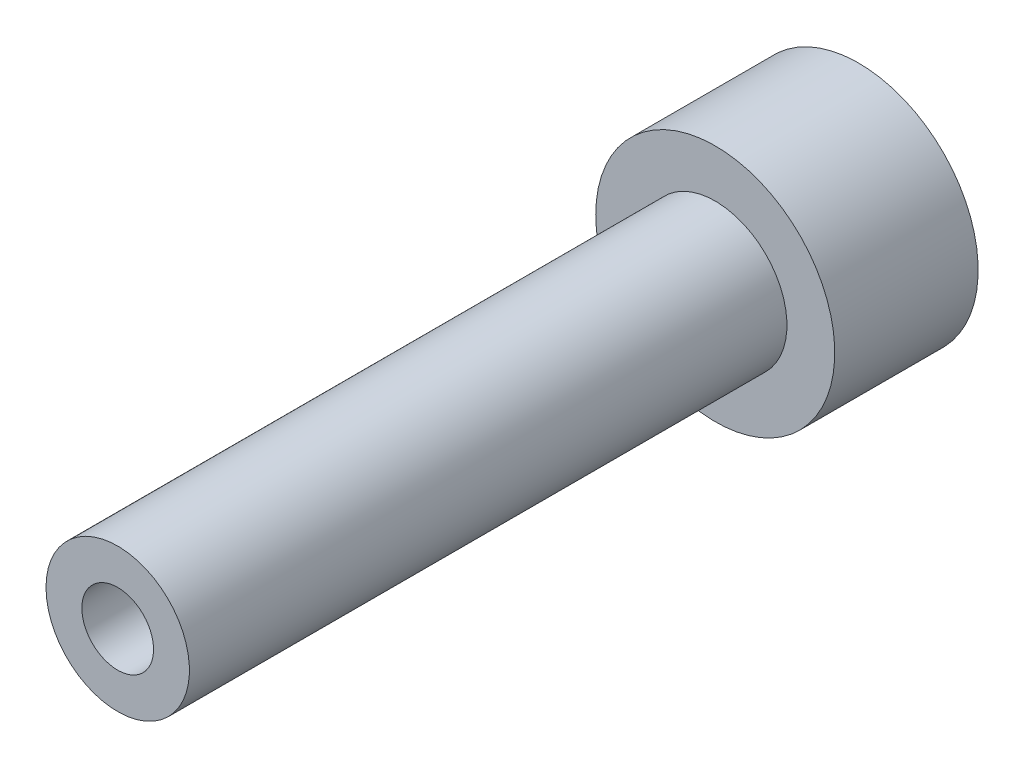
ISO-10303-21;
HEADER;
FILE_DESCRIPTION(('STEP AP214'),'2;1');
FILE_NAME('part.step','',(''),(''),'','','');
FILE_SCHEMA(('AUTOMOTIVE_DESIGN { 1 0 10303 214 1 1 1 1 }'));
ENDSEC;
DATA;
#1=APPLICATION_CONTEXT('core data for automotive mechanical design processes');
#2=APPLICATION_PROTOCOL_DEFINITION('international standard','automotive_design',2000,#1);
#3=PRODUCT_CONTEXT('',#1,'mechanical');
#4=PRODUCT('Part','Part','',(#3));
#5=PRODUCT_RELATED_PRODUCT_CATEGORY('part','',(#4));
#6=PRODUCT_DEFINITION_FORMATION('','',#4);
#7=PRODUCT_DEFINITION_CONTEXT('part definition',#1,'design');
#8=PRODUCT_DEFINITION('design','',#6,#7);
#9=PRODUCT_DEFINITION_SHAPE('','',#8);
#10=(LENGTH_UNIT() NAMED_UNIT(*) SI_UNIT(.MILLI.,.METRE.));
#11=(NAMED_UNIT(*) PLANE_ANGLE_UNIT() SI_UNIT($,.RADIAN.));
#12=(NAMED_UNIT(*) SI_UNIT($,.STERADIAN.) SOLID_ANGLE_UNIT());
#13=UNCERTAINTY_MEASURE_WITH_UNIT(LENGTH_MEASURE(1.E-05),#10,'distance_accuracy_value','');
#14=(GEOMETRIC_REPRESENTATION_CONTEXT(3) GLOBAL_UNCERTAINTY_ASSIGNED_CONTEXT((#13)) GLOBAL_UNIT_ASSIGNED_CONTEXT((#10,
#11,#12)) REPRESENTATION_CONTEXT('',''));
#15=CARTESIAN_POINT('',(0.,0.,0.));
#16=DIRECTION('',(0.,0.,1.));
#17=DIRECTION('',(1.,0.,0.));
#18=AXIS2_PLACEMENT_3D('',#15,#16,#17);
#19=CARTESIAN_POINT('',(0.,0.,0.));
#20=DIRECTION('',(0.,0.,-1.));
#21=DIRECTION('',(-1.,0.,0.));
#22=AXIS2_PLACEMENT_3D('',#19,#20,#21);
#23=CYLINDRICAL_SURFACE('',#22,0.85);
#24=CARTESIAN_POINT('',(0.,0.,0.));
#25=DIRECTION('',(0.,0.,-1.));
#26=DIRECTION('',(-1.,0.,0.));
#27=AXIS2_PLACEMENT_3D('',#24,#25,#26);
#28=CIRCLE('',#27,0.85);
#29=CARTESIAN_POINT('',(-0.85,0.,0.));
#30=VERTEX_POINT('',#29);
#31=EDGE_CURVE('E10',#30,#30,#28,.T.);
#32=ORIENTED_EDGE('',*,*,#31,.T.);
#33=EDGE_LOOP('',(#32));
#34=FACE_BOUND('',#33,.T.);
#35=CARTESIAN_POINT('',(0.,0.,2.));
#36=DIRECTION('',(0.,0.,-1.));
#37=DIRECTION('',(-1.,0.,0.));
#38=AXIS2_PLACEMENT_3D('',#35,#36,#37);
#39=CIRCLE('',#38,0.85);
#40=CARTESIAN_POINT('',(-0.85,0.,2.));
#41=VERTEX_POINT('',#40);
#42=EDGE_CURVE('E62',#41,#41,#39,.T.);
#43=ORIENTED_EDGE('',*,*,#42,.F.);
#44=EDGE_LOOP('',(#43));
#45=FACE_BOUND('',#44,.T.);
#46=ADVANCED_FACE('F34',(#34,#45),#23,.F.);
#47=CARTESIAN_POINT('',(0.,0.85,0.));
#48=DIRECTION('',(0.,0.,-1.));
#49=DIRECTION('',(-1.,0.,0.));
#50=AXIS2_PLACEMENT_3D('',#47,#48,#49);
#51=PLANE('',#50);
#52=CARTESIAN_POINT('',(0.,0.,0.));
#53=DIRECTION('',(0.,0.,-1.));
#54=DIRECTION('',(-1.,0.,0.));
#55=AXIS2_PLACEMENT_3D('',#52,#53,#54);
#56=CIRCLE('',#55,2.5);
#57=CARTESIAN_POINT('',(-2.5,0.,0.));
#58=VERTEX_POINT('',#57);
#59=EDGE_CURVE('E40',#58,#58,#56,.T.);
#60=ORIENTED_EDGE('',*,*,#59,.T.);
#61=EDGE_LOOP('',(#60));
#62=FACE_BOUND('',#61,.T.);
#63=ORIENTED_EDGE('',*,*,#31,.F.);
#64=EDGE_LOOP('',(#63));
#65=FACE_BOUND('',#64,.T.);
#66=ADVANCED_FACE('F70',(#62,#65),#51,.T.);
#67=CARTESIAN_POINT('',(0.,0.,0.));
#68=DIRECTION('',(0.,0.,-1.));
#69=DIRECTION('',(-1.,0.,0.));
#70=AXIS2_PLACEMENT_3D('',#67,#68,#69);
#71=CYLINDRICAL_SURFACE('',#70,2.5);
#72=CARTESIAN_POINT('',(0.,0.,3.));
#73=DIRECTION('',(0.,0.,-1.));
#74=DIRECTION('',(-1.,0.,0.));
#75=AXIS2_PLACEMENT_3D('',#72,#73,#74);
#76=CIRCLE('',#75,2.5);
#77=CARTESIAN_POINT('',(-2.5,0.,3.));
#78=VERTEX_POINT('',#77);
#79=EDGE_CURVE('E44',#78,#78,#76,.T.);
#80=ORIENTED_EDGE('',*,*,#79,.T.);
#81=EDGE_LOOP('',(#80));
#82=FACE_BOUND('',#81,.T.);
#83=ORIENTED_EDGE('',*,*,#59,.F.);
#84=EDGE_LOOP('',(#83));
#85=FACE_BOUND('',#84,.T.);
#86=ADVANCED_FACE('F74',(#82,#85),#71,.T.);
#87=CARTESIAN_POINT('',(0.,2.5,3.));
#88=DIRECTION('',(0.,0.,1.));
#89=DIRECTION('',(1.,0.,0.));
#90=AXIS2_PLACEMENT_3D('',#87,#88,#89);
#91=PLANE('',#90);
#92=CARTESIAN_POINT('',(0.,0.,3.));
#93=DIRECTION('',(0.,0.,-1.));
#94=DIRECTION('',(-1.,0.,0.));
#95=AXIS2_PLACEMENT_3D('',#92,#93,#94);
#96=CIRCLE('',#95,1.5);
#97=CARTESIAN_POINT('',(-1.5,0.,3.));
#98=VERTEX_POINT('',#97);
#99=EDGE_CURVE('E48',#98,#98,#96,.T.);
#100=ORIENTED_EDGE('',*,*,#99,.T.);
#101=EDGE_LOOP('',(#100));
#102=FACE_BOUND('',#101,.T.);
#103=ORIENTED_EDGE('',*,*,#79,.F.);
#104=EDGE_LOOP('',(#103));
#105=FACE_BOUND('',#104,.T.);
#106=ADVANCED_FACE('F78',(#102,#105),#91,.T.);
#107=CARTESIAN_POINT('',(0.,0.,0.));
#108=DIRECTION('',(0.,0.,-1.));
#109=DIRECTION('',(-1.,0.,0.));
#110=AXIS2_PLACEMENT_3D('',#107,#108,#109);
#111=CYLINDRICAL_SURFACE('',#110,1.5);
#112=CARTESIAN_POINT('',(0.,0.,15.5));
#113=DIRECTION('',(0.,0.,-1.));
#114=DIRECTION('',(-1.,0.,0.));
#115=AXIS2_PLACEMENT_3D('',#112,#113,#114);
#116=CIRCLE('',#115,1.5);
#117=CARTESIAN_POINT('',(-1.5,0.,15.5));
#118=VERTEX_POINT('',#117);
#119=EDGE_CURVE('E53',#118,#118,#116,.T.);
#120=ORIENTED_EDGE('',*,*,#119,.T.);
#121=EDGE_LOOP('',(#120));
#122=FACE_BOUND('',#121,.T.);
#123=ORIENTED_EDGE('',*,*,#99,.F.);
#124=EDGE_LOOP('',(#123));
#125=FACE_BOUND('',#124,.T.);
#126=ADVANCED_FACE('F85',(#122,#125),#111,.T.);
#127=CARTESIAN_POINT('',(0.,1.5,15.5));
#128=DIRECTION('',(0.,0.,1.));
#129=DIRECTION('',(1.,0.,0.));
#130=AXIS2_PLACEMENT_3D('',#127,#128,#129);
#131=PLANE('',#130);
#132=CARTESIAN_POINT('',(0.,0.,15.5));
#133=DIRECTION('',(0.,0.,-1.));
#134=DIRECTION('',(-1.,0.,0.));
#135=AXIS2_PLACEMENT_3D('',#132,#133,#134);
#136=CIRCLE('',#135,0.749999999999996);
#137=CARTESIAN_POINT('',(-0.749999999999996,0.,15.5));
#138=VERTEX_POINT('',#137);
#139=EDGE_CURVE('E56',#138,#138,#136,.T.);
#140=ORIENTED_EDGE('',*,*,#139,.T.);
#141=EDGE_LOOP('',(#140));
#142=FACE_BOUND('',#141,.T.);
#143=ORIENTED_EDGE('',*,*,#119,.F.);
#144=EDGE_LOOP('',(#143));
#145=FACE_BOUND('',#144,.T.);
#146=ADVANCED_FACE('F89',(#142,#145),#131,.T.);
#147=CARTESIAN_POINT('',(0.,0.,0.));
#148=DIRECTION('',(0.,0.,-1.));
#149=DIRECTION('',(-1.,0.,0.));
#150=AXIS2_PLACEMENT_3D('',#147,#148,#149);
#151=CYLINDRICAL_SURFACE('',#150,0.749999999999996);
#152=CARTESIAN_POINT('',(0.,0.,2.));
#153=DIRECTION('',(0.,0.,-1.));
#154=DIRECTION('',(-1.,0.,0.));
#155=AXIS2_PLACEMENT_3D('',#152,#153,#154);
#156=CIRCLE('',#155,0.749999999999996);
#157=CARTESIAN_POINT('',(-0.749999999999996,0.,2.));
#158=VERTEX_POINT('',#157);
#159=EDGE_CURVE('E59',#158,#158,#156,.T.);
#160=ORIENTED_EDGE('',*,*,#159,.T.);
#161=EDGE_LOOP('',(#160));
#162=FACE_BOUND('',#161,.T.);
#163=ORIENTED_EDGE('',*,*,#139,.F.);
#164=EDGE_LOOP('',(#163));
#165=FACE_BOUND('',#164,.T.);
#166=ADVANCED_FACE('F93',(#162,#165),#151,.F.);
#167=CARTESIAN_POINT('',(0.,0.749999999999996,2.));
#168=DIRECTION('',(0.,0.,-1.));
#169=DIRECTION('',(-1.,0.,0.));
#170=AXIS2_PLACEMENT_3D('',#167,#168,#169);
#171=PLANE('',#170);
#172=ORIENTED_EDGE('',*,*,#42,.T.);
#173=EDGE_LOOP('',(#172));
#174=FACE_BOUND('',#173,.T.);
#175=ORIENTED_EDGE('',*,*,#159,.F.);
#176=EDGE_LOOP('',(#175));
#177=FACE_BOUND('',#176,.T.);
#178=ADVANCED_FACE('F66',(#174,#177),#171,.T.);
#179=CLOSED_SHELL('',(#46,#66,#86,#106,#126,#146,#166,#178));
#180=MANIFOLD_SOLID_BREP('B2',#179);
#181=ADVANCED_BREP_SHAPE_REPRESENTATION('',(#18,#180),#14);
#182=SHAPE_DEFINITION_REPRESENTATION(#9,#181);
ENDSEC;
END-ISO-10303-21;
